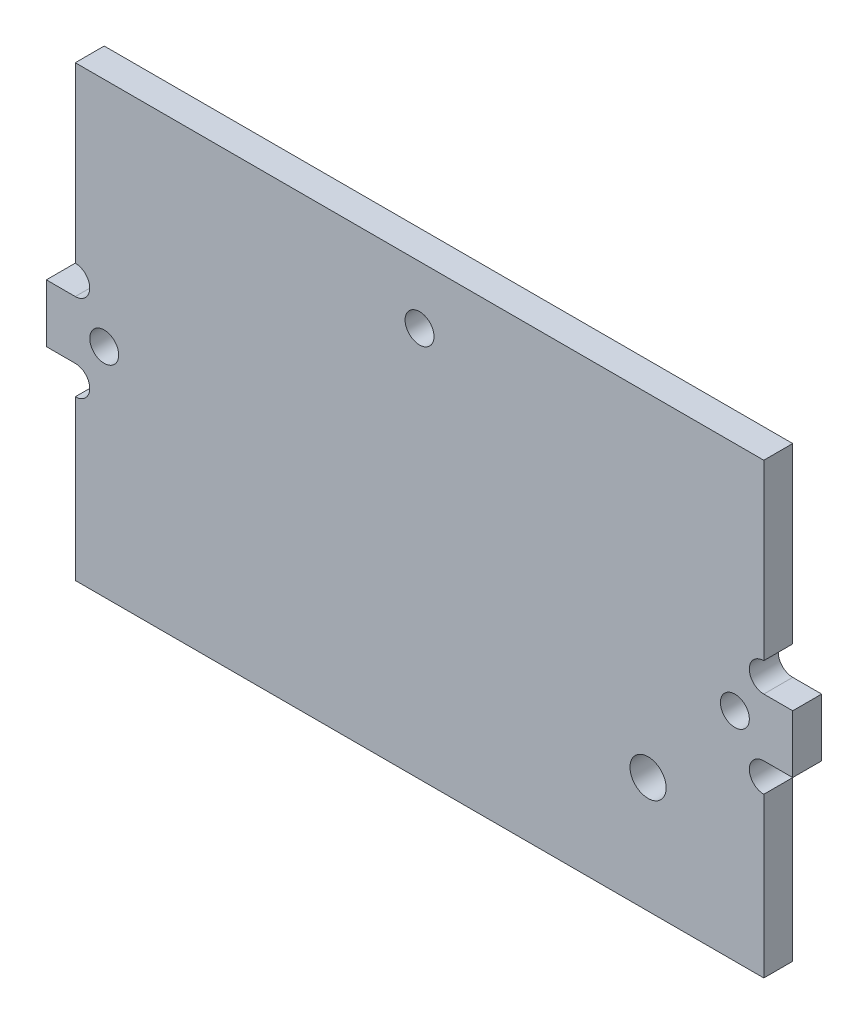
ISO-10303-21;
HEADER;
FILE_DESCRIPTION(('STEP AP214'),'2;1');
FILE_NAME('part.step','',(''),(''),'','','');
FILE_SCHEMA(('AUTOMOTIVE_DESIGN { 1 0 10303 214 1 1 1 1 }'));
ENDSEC;
DATA;
#1=APPLICATION_CONTEXT('core data for automotive mechanical design processes');
#2=APPLICATION_PROTOCOL_DEFINITION('international standard','automotive_design',2000,#1);
#3=PRODUCT_CONTEXT('',#1,'mechanical');
#4=PRODUCT('Part','Part','',(#3));
#5=PRODUCT_RELATED_PRODUCT_CATEGORY('part','',(#4));
#6=PRODUCT_DEFINITION_FORMATION('','',#4);
#7=PRODUCT_DEFINITION_CONTEXT('part definition',#1,'design');
#8=PRODUCT_DEFINITION('design','',#6,#7);
#9=PRODUCT_DEFINITION_SHAPE('','',#8);
#10=(LENGTH_UNIT() NAMED_UNIT(*) SI_UNIT(.MILLI.,.METRE.));
#11=(NAMED_UNIT(*) PLANE_ANGLE_UNIT() SI_UNIT($,.RADIAN.));
#12=(NAMED_UNIT(*) SI_UNIT($,.STERADIAN.) SOLID_ANGLE_UNIT());
#13=UNCERTAINTY_MEASURE_WITH_UNIT(LENGTH_MEASURE(1.E-05),#10,'distance_accuracy_value','');
#14=(GEOMETRIC_REPRESENTATION_CONTEXT(3) GLOBAL_UNCERTAINTY_ASSIGNED_CONTEXT((#13)) GLOBAL_UNIT_ASSIGNED_CONTEXT((#10,
#11,#12)) REPRESENTATION_CONTEXT('',''));
#15=CARTESIAN_POINT('',(0.,0.,0.));
#16=DIRECTION('',(0.,0.,1.));
#17=DIRECTION('',(1.,0.,0.));
#18=AXIS2_PLACEMENT_3D('',#15,#16,#17);
#19=CARTESIAN_POINT('',(19.0580949327945,4.88200589970501,2.));
#20=DIRECTION('',(0.,0.,-1.));
#21=DIRECTION('',(-1.,0.,0.));
#22=AXIS2_PLACEMENT_3D('',#19,#20,#21);
#23=PLANE('',#22);
#24=DIRECTION('',(-1.,0.,0.));
#25=VECTOR('',#24,1.);
#26=CARTESIAN_POINT('',(18.0580949327945,17.882005899705,2.));
#27=LINE('',#26,#25);
#28=CARTESIAN_POINT('',(19.0580949327945,17.882005899705,2.));
#29=VERTEX_POINT('',#28);
#30=CARTESIAN_POINT('',(-28.5419050672055,17.882005899705,2.));
#31=VERTEX_POINT('',#30);
#32=EDGE_CURVE('E111',#29,#31,#27,.T.);
#33=ORIENTED_EDGE('',*,*,#32,.T.);
#34=DIRECTION('',(0.,-1.,0.));
#35=VECTOR('',#34,1.);
#36=CARTESIAN_POINT('',(-28.5419050672055,17.882005899705,2.));
#37=LINE('',#36,#35);
#38=CARTESIAN_POINT('',(-28.5419050672055,5.88200589970501,2.));
#39=VERTEX_POINT('',#38);
#40=EDGE_CURVE('E299',#31,#39,#37,.T.);
#41=ORIENTED_EDGE('',*,*,#40,.T.);
#42=CARTESIAN_POINT('',(-28.5419050672055,4.88200589970501,2.));
#43=DIRECTION('',(0.,0.,-1.));
#44=DIRECTION('',(1.,0.,0.));
#45=AXIS2_PLACEMENT_3D('',#42,#43,#44);
#46=CIRCLE('',#45,1.);
#47=CARTESIAN_POINT('',(-28.5419050672055,3.88200589970501,2.));
#48=VERTEX_POINT('',#47);
#49=EDGE_CURVE('E250',#39,#48,#46,.T.);
#50=ORIENTED_EDGE('',*,*,#49,.T.);
#51=DIRECTION('',(-1.,0.,0.));
#52=VECTOR('',#51,1.);
#53=CARTESIAN_POINT('',(-28.5419050672055,3.88200589970501,2.));
#54=LINE('',#53,#52);
#55=CARTESIAN_POINT('',(-30.5419050672055,3.88200589970501,2.));
#56=VERTEX_POINT('',#55);
#57=EDGE_CURVE('E269',#48,#56,#54,.T.);
#58=ORIENTED_EDGE('',*,*,#57,.T.);
#59=DIRECTION('',(0.,-1.,0.));
#60=VECTOR('',#59,1.);
#61=CARTESIAN_POINT('',(-30.5419050672055,3.88200589970501,2.));
#62=LINE('',#61,#60);
#63=CARTESIAN_POINT('',(-30.5419050672055,-0.117994100294988,2.));
#64=VERTEX_POINT('',#63);
#65=EDGE_CURVE('E266',#56,#64,#62,.T.);
#66=ORIENTED_EDGE('',*,*,#65,.T.);
#67=DIRECTION('',(1.,0.,0.));
#68=VECTOR('',#67,1.);
#69=CARTESIAN_POINT('',(-28.5419050672055,-0.117994100294988,2.));
#70=LINE('',#69,#68);
#71=CARTESIAN_POINT('',(-28.5419050672055,-0.117994100294988,2.));
#72=VERTEX_POINT('',#71);
#73=EDGE_CURVE('E268',#64,#72,#70,.T.);
#74=ORIENTED_EDGE('',*,*,#73,.T.);
#75=CARTESIAN_POINT('',(-28.5419050672055,-1.11799410029499,2.));
#76=DIRECTION('',(0.,0.,-1.));
#77=DIRECTION('',(-1.,0.,0.));
#78=AXIS2_PLACEMENT_3D('',#75,#76,#77);
#79=CIRCLE('',#78,1.);
#80=CARTESIAN_POINT('',(-28.5419050672055,-2.11799410029499,2.));
#81=VERTEX_POINT('',#80);
#82=EDGE_CURVE('E271',#72,#81,#79,.T.);
#83=ORIENTED_EDGE('',*,*,#82,.T.);
#84=DIRECTION('',(0.,-1.,0.));
#85=VECTOR('',#84,1.);
#86=CARTESIAN_POINT('',(-28.5419050672055,-2.11799410029499,2.));
#87=LINE('',#86,#85);
#88=CARTESIAN_POINT('',(-28.5419050672055,-13.117994100295,2.));
#89=VERTEX_POINT('',#88);
#90=EDGE_CURVE('E277',#81,#89,#87,.T.);
#91=ORIENTED_EDGE('',*,*,#90,.T.);
#92=DIRECTION('',(1.,0.,0.));
#93=VECTOR('',#92,1.);
#94=CARTESIAN_POINT('',(-28.5419050672055,-13.117994100295,2.));
#95=LINE('',#94,#93);
#96=CARTESIAN_POINT('',(19.0580949327945,-13.117994100295,2.));
#97=VERTEX_POINT('',#96);
#98=EDGE_CURVE('E279',#89,#97,#95,.T.);
#99=ORIENTED_EDGE('',*,*,#98,.T.);
#100=DIRECTION('',(0.,1.,0.));
#101=VECTOR('',#100,1.);
#102=CARTESIAN_POINT('',(19.0580949327945,-12.117994100295,2.));
#103=LINE('',#102,#101);
#104=CARTESIAN_POINT('',(19.0580949327945,-2.11799410029499,2.));
#105=VERTEX_POINT('',#104);
#106=EDGE_CURVE('E281',#97,#105,#103,.T.);
#107=ORIENTED_EDGE('',*,*,#106,.T.);
#108=CARTESIAN_POINT('',(19.0580949327945,-1.11799410029499,2.));
#109=DIRECTION('',(0.,0.,-1.));
#110=DIRECTION('',(1.,0.,0.));
#111=AXIS2_PLACEMENT_3D('',#108,#109,#110);
#112=CIRCLE('',#111,1.);
#113=CARTESIAN_POINT('',(19.0580949327945,-0.117994100294988,2.));
#114=VERTEX_POINT('',#113);
#115=EDGE_CURVE('E283',#105,#114,#112,.T.);
#116=ORIENTED_EDGE('',*,*,#115,.T.);
#117=DIRECTION('',(1.,0.,0.));
#118=VECTOR('',#117,1.);
#119=CARTESIAN_POINT('',(19.0580949327945,-0.117994100294988,2.));
#120=LINE('',#119,#118);
#121=CARTESIAN_POINT('',(21.0580949327945,-0.117994100294988,2.));
#122=VERTEX_POINT('',#121);
#123=EDGE_CURVE('E285',#114,#122,#120,.T.);
#124=ORIENTED_EDGE('',*,*,#123,.T.);
#125=DIRECTION('',(0.,1.,0.));
#126=VECTOR('',#125,1.);
#127=CARTESIAN_POINT('',(21.0580949327945,3.88200589970501,2.));
#128=LINE('',#127,#126);
#129=CARTESIAN_POINT('',(21.0580949327945,3.88200589970501,2.));
#130=VERTEX_POINT('',#129);
#131=EDGE_CURVE('E156',#122,#130,#128,.T.);
#132=ORIENTED_EDGE('',*,*,#131,.T.);
#133=DIRECTION('',(-1.,0.,0.));
#134=VECTOR('',#133,1.);
#135=CARTESIAN_POINT('',(19.0580949327945,3.88200589970501,2.));
#136=LINE('',#135,#134);
#137=CARTESIAN_POINT('',(19.0580949327945,3.88200589970501,2.));
#138=VERTEX_POINT('',#137);
#139=EDGE_CURVE('E149',#130,#138,#136,.T.);
#140=ORIENTED_EDGE('',*,*,#139,.T.);
#141=CARTESIAN_POINT('',(19.0580949327945,4.88200589970501,2.));
#142=DIRECTION('',(0.,0.,-1.));
#143=DIRECTION('',(-1.,0.,0.));
#144=AXIS2_PLACEMENT_3D('',#141,#142,#143);
#145=CIRCLE('',#144,1.);
#146=CARTESIAN_POINT('',(19.0580949327945,5.88200589970501,2.));
#147=VERTEX_POINT('',#146);
#148=EDGE_CURVE('E153',#138,#147,#145,.T.);
#149=ORIENTED_EDGE('',*,*,#148,.T.);
#150=DIRECTION('',(0.,1.,0.));
#151=VECTOR('',#150,1.);
#152=CARTESIAN_POINT('',(19.0580949327945,9.88200589970501,2.));
#153=LINE('',#152,#151);
#154=EDGE_CURVE('E49',#147,#29,#153,.T.);
#155=ORIENTED_EDGE('',*,*,#154,.T.);
#156=EDGE_LOOP('',(#33,#41,#50,#58,#66,#74,#83,#91,#99,#107,#116,#124,#132,#140,#149,#155));
#157=FACE_BOUND('',#156,.T.);
#158=CARTESIAN_POINT('',(11.0580949327945,-5.11799410029498,2.));
#159=DIRECTION('',(0.,0.,1.));
#160=DIRECTION('',(1.,0.,0.));
#161=AXIS2_PLACEMENT_3D('',#158,#159,#160);
#162=CIRCLE('',#161,1.25);
#163=CARTESIAN_POINT('',(12.3080949327945,-5.11799410029498,2.));
#164=VERTEX_POINT('',#163);
#165=EDGE_CURVE('E179',#164,#164,#162,.T.);
#166=ORIENTED_EDGE('',*,*,#165,.F.);
#167=EDGE_LOOP('',(#166));
#168=FACE_BOUND('',#167,.T.);
#169=CARTESIAN_POINT('',(-26.5419050672055,1.88200589970501,2.));
#170=DIRECTION('',(0.,0.,1.));
#171=DIRECTION('',(1.,0.,0.));
#172=AXIS2_PLACEMENT_3D('',#169,#170,#171);
#173=CIRCLE('',#172,1.);
#174=CARTESIAN_POINT('',(-25.5419050672055,1.88200589970501,2.));
#175=VERTEX_POINT('',#174);
#176=EDGE_CURVE('E555',#175,#175,#173,.T.);
#177=ORIENTED_EDGE('',*,*,#176,.F.);
#178=EDGE_LOOP('',(#177));
#179=FACE_BOUND('',#178,.T.);
#180=CARTESIAN_POINT('',(17.0580949327945,1.88200589970501,2.));
#181=DIRECTION('',(0.,0.,1.));
#182=DIRECTION('',(1.,0.,0.));
#183=AXIS2_PLACEMENT_3D('',#180,#181,#182);
#184=CIRCLE('',#183,1.);
#185=CARTESIAN_POINT('',(18.0580949327945,1.88200589970501,2.));
#186=VERTEX_POINT('',#185);
#187=EDGE_CURVE('E549',#186,#186,#184,.T.);
#188=ORIENTED_EDGE('',*,*,#187,.F.);
#189=EDGE_LOOP('',(#188));
#190=FACE_BOUND('',#189,.T.);
#191=CARTESIAN_POINT('',(-4.74190506720547,13.882005899705,2.));
#192=DIRECTION('',(0.,0.,1.));
#193=DIRECTION('',(1.,0.,0.));
#194=AXIS2_PLACEMENT_3D('',#191,#192,#193);
#195=CIRCLE('',#194,1.);
#196=CARTESIAN_POINT('',(-3.74190506720547,13.882005899705,2.));
#197=VERTEX_POINT('',#196);
#198=EDGE_CURVE('E540',#197,#197,#195,.T.);
#199=ORIENTED_EDGE('',*,*,#198,.F.);
#200=EDGE_LOOP('',(#199));
#201=FACE_BOUND('',#200,.T.);
#202=ADVANCED_FACE('F32',(#157,#168,#179,#190,#201),#23,.F.);
#203=CARTESIAN_POINT('',(19.0580949327945,4.88200589970501,0.));
#204=DIRECTION('',(0.,0.,-1.));
#205=DIRECTION('',(-1.,0.,0.));
#206=AXIS2_PLACEMENT_3D('',#203,#204,#205);
#207=PLANE('',#206);
#208=CARTESIAN_POINT('',(17.0580949327945,1.88200589970501,0.));
#209=DIRECTION('',(0.,0.,1.));
#210=DIRECTION('',(1.,0.,0.));
#211=AXIS2_PLACEMENT_3D('',#208,#209,#210);
#212=CIRCLE('',#211,1.);
#213=CARTESIAN_POINT('',(18.0580949327945,1.88200589970501,0.));
#214=VERTEX_POINT('',#213);
#215=EDGE_CURVE('E546',#214,#214,#212,.T.);
#216=ORIENTED_EDGE('',*,*,#215,.T.);
#217=EDGE_LOOP('',(#216));
#218=FACE_BOUND('',#217,.T.);
#219=CARTESIAN_POINT('',(11.0580949327945,-5.11799410029498,0.));
#220=DIRECTION('',(0.,0.,1.));
#221=DIRECTION('',(1.,0.,0.));
#222=AXIS2_PLACEMENT_3D('',#219,#220,#221);
#223=CIRCLE('',#222,1.25);
#224=CARTESIAN_POINT('',(12.3080949327945,-5.11799410029498,0.));
#225=VERTEX_POINT('',#224);
#226=EDGE_CURVE('E303',#225,#225,#223,.T.);
#227=ORIENTED_EDGE('',*,*,#226,.T.);
#228=EDGE_LOOP('',(#227));
#229=FACE_BOUND('',#228,.T.);
#230=DIRECTION('',(-1.,0.,0.));
#231=VECTOR('',#230,1.);
#232=CARTESIAN_POINT('',(-27.5419050672055,17.882005899705,0.));
#233=LINE('',#232,#231);
#234=CARTESIAN_POINT('',(19.0580949327945,17.882005899705,0.));
#235=VERTEX_POINT('',#234);
#236=CARTESIAN_POINT('',(-28.5419050672055,17.882005899705,0.));
#237=VERTEX_POINT('',#236);
#238=EDGE_CURVE('E106',#235,#237,#233,.T.);
#239=ORIENTED_EDGE('',*,*,#238,.F.);
#240=DIRECTION('',(0.,1.,0.));
#241=VECTOR('',#240,1.);
#242=CARTESIAN_POINT('',(19.0580949327945,17.882005899705,0.));
#243=LINE('',#242,#241);
#244=CARTESIAN_POINT('',(19.0580949327945,5.88200589970501,0.));
#245=VERTEX_POINT('',#244);
#246=EDGE_CURVE('E102',#245,#235,#243,.T.);
#247=ORIENTED_EDGE('',*,*,#246,.F.);
#248=CARTESIAN_POINT('',(19.0580949327945,4.88200589970501,0.));
#249=DIRECTION('',(0.,0.,-1.));
#250=DIRECTION('',(-1.,0.,0.));
#251=AXIS2_PLACEMENT_3D('',#248,#249,#250);
#252=CIRCLE('',#251,1.);
#253=CARTESIAN_POINT('',(19.0580949327945,3.88200589970501,0.));
#254=VERTEX_POINT('',#253);
#255=EDGE_CURVE('E207',#254,#245,#252,.T.);
#256=ORIENTED_EDGE('',*,*,#255,.F.);
#257=DIRECTION('',(-1.,0.,0.));
#258=VECTOR('',#257,1.);
#259=CARTESIAN_POINT('',(19.0580949327945,3.88200589970501,0.));
#260=LINE('',#259,#258);
#261=CARTESIAN_POINT('',(21.0580949327945,3.88200589970501,0.));
#262=VERTEX_POINT('',#261);
#263=EDGE_CURVE('E165',#262,#254,#260,.T.);
#264=ORIENTED_EDGE('',*,*,#263,.F.);
#265=DIRECTION('',(0.,1.,0.));
#266=VECTOR('',#265,1.);
#267=CARTESIAN_POINT('',(21.0580949327945,3.88200589970501,0.));
#268=LINE('',#267,#266);
#269=CARTESIAN_POINT('',(21.0580949327945,-0.117994100294988,0.));
#270=VERTEX_POINT('',#269);
#271=EDGE_CURVE('E204',#270,#262,#268,.T.);
#272=ORIENTED_EDGE('',*,*,#271,.F.);
#273=DIRECTION('',(1.,0.,0.));
#274=VECTOR('',#273,1.);
#275=CARTESIAN_POINT('',(19.0580949327945,-0.117994100294988,0.));
#276=LINE('',#275,#274);
#277=CARTESIAN_POINT('',(19.0580949327945,-0.117994100294988,0.));
#278=VERTEX_POINT('',#277);
#279=EDGE_CURVE('E202',#278,#270,#276,.T.);
#280=ORIENTED_EDGE('',*,*,#279,.F.);
#281=CARTESIAN_POINT('',(19.0580949327945,-1.11799410029499,0.));
#282=DIRECTION('',(0.,0.,-1.));
#283=DIRECTION('',(1.,0.,0.));
#284=AXIS2_PLACEMENT_3D('',#281,#282,#283);
#285=CIRCLE('',#284,1.);
#286=CARTESIAN_POINT('',(19.0580949327945,-2.11799410029499,0.));
#287=VERTEX_POINT('',#286);
#288=EDGE_CURVE('E200',#287,#278,#285,.T.);
#289=ORIENTED_EDGE('',*,*,#288,.F.);
#290=DIRECTION('',(0.,1.,0.));
#291=VECTOR('',#290,1.);
#292=CARTESIAN_POINT('',(19.0580949327945,-2.11799410029499,0.));
#293=LINE('',#292,#291);
#294=CARTESIAN_POINT('',(19.0580949327945,-13.117994100295,0.));
#295=VERTEX_POINT('',#294);
#296=EDGE_CURVE('E198',#295,#287,#293,.T.);
#297=ORIENTED_EDGE('',*,*,#296,.F.);
#298=DIRECTION('',(1.,0.,0.));
#299=VECTOR('',#298,1.);
#300=CARTESIAN_POINT('',(19.0580949327945,-13.117994100295,0.));
#301=LINE('',#300,#299);
#302=CARTESIAN_POINT('',(-28.5419050672055,-13.117994100295,0.));
#303=VERTEX_POINT('',#302);
#304=EDGE_CURVE('E195',#303,#295,#301,.T.);
#305=ORIENTED_EDGE('',*,*,#304,.F.);
#306=DIRECTION('',(0.,-1.,0.));
#307=VECTOR('',#306,1.);
#308=CARTESIAN_POINT('',(-28.5419050672055,-12.117994100295,0.));
#309=LINE('',#308,#307);
#310=CARTESIAN_POINT('',(-28.5419050672055,-2.11799410029499,0.));
#311=VERTEX_POINT('',#310);
#312=EDGE_CURVE('E192',#311,#303,#309,.T.);
#313=ORIENTED_EDGE('',*,*,#312,.F.);
#314=CARTESIAN_POINT('',(-28.5419050672055,-1.11799410029499,0.));
#315=DIRECTION('',(0.,0.,-1.));
#316=DIRECTION('',(-1.,0.,0.));
#317=AXIS2_PLACEMENT_3D('',#314,#315,#316);
#318=CIRCLE('',#317,1.);
#319=CARTESIAN_POINT('',(-28.5419050672055,-0.117994100294988,0.));
#320=VERTEX_POINT('',#319);
#321=EDGE_CURVE('E189',#320,#311,#318,.T.);
#322=ORIENTED_EDGE('',*,*,#321,.F.);
#323=DIRECTION('',(1.,0.,0.));
#324=VECTOR('',#323,1.);
#325=CARTESIAN_POINT('',(-28.5419050672055,-0.117994100294988,0.));
#326=LINE('',#325,#324);
#327=CARTESIAN_POINT('',(-30.5419050672055,-0.117994100294988,0.));
#328=VERTEX_POINT('',#327);
#329=EDGE_CURVE('E187',#328,#320,#326,.T.);
#330=ORIENTED_EDGE('',*,*,#329,.F.);
#331=DIRECTION('',(0.,-1.,0.));
#332=VECTOR('',#331,1.);
#333=CARTESIAN_POINT('',(-30.5419050672055,3.88200589970501,0.));
#334=LINE('',#333,#332);
#335=CARTESIAN_POINT('',(-30.5419050672055,3.88200589970501,0.));
#336=VERTEX_POINT('',#335);
#337=EDGE_CURVE('E185',#336,#328,#334,.T.);
#338=ORIENTED_EDGE('',*,*,#337,.F.);
#339=DIRECTION('',(-1.,0.,0.));
#340=VECTOR('',#339,1.);
#341=CARTESIAN_POINT('',(-28.5419050672055,3.88200589970501,0.));
#342=LINE('',#341,#340);
#343=CARTESIAN_POINT('',(-28.5419050672055,3.88200589970501,0.));
#344=VERTEX_POINT('',#343);
#345=EDGE_CURVE('E183',#344,#336,#342,.T.);
#346=ORIENTED_EDGE('',*,*,#345,.F.);
#347=CARTESIAN_POINT('',(-28.5419050672055,4.88200589970501,0.));
#348=DIRECTION('',(0.,0.,-1.));
#349=DIRECTION('',(1.,0.,0.));
#350=AXIS2_PLACEMENT_3D('',#347,#348,#349);
#351=CIRCLE('',#350,1.);
#352=CARTESIAN_POINT('',(-28.5419050672055,5.88200589970501,0.));
#353=VERTEX_POINT('',#352);
#354=EDGE_CURVE('E181',#353,#344,#351,.T.);
#355=ORIENTED_EDGE('',*,*,#354,.F.);
#356=DIRECTION('',(0.,-1.,0.));
#357=VECTOR('',#356,1.);
#358=CARTESIAN_POINT('',(-28.5419050672055,9.88200589970501,0.));
#359=LINE('',#358,#357);
#360=EDGE_CURVE('E178',#237,#353,#359,.T.);
#361=ORIENTED_EDGE('',*,*,#360,.F.);
#362=EDGE_LOOP('',(#239,#247,#256,#264,#272,#280,#289,#297,#305,#313,#322,#330,#338,#346,#355,#361));
#363=FACE_BOUND('',#362,.T.);
#364=CARTESIAN_POINT('',(-26.5419050672055,1.88200589970501,0.));
#365=DIRECTION('',(0.,0.,1.));
#366=DIRECTION('',(1.,0.,0.));
#367=AXIS2_PLACEMENT_3D('',#364,#365,#366);
#368=CIRCLE('',#367,1.);
#369=CARTESIAN_POINT('',(-25.5419050672055,1.88200589970501,0.));
#370=VERTEX_POINT('',#369);
#371=EDGE_CURVE('E552',#370,#370,#368,.T.);
#372=ORIENTED_EDGE('',*,*,#371,.T.);
#373=EDGE_LOOP('',(#372));
#374=FACE_BOUND('',#373,.T.);
#375=CARTESIAN_POINT('',(-4.74190506720547,13.882005899705,0.));
#376=DIRECTION('',(0.,0.,1.));
#377=DIRECTION('',(1.,0.,0.));
#378=AXIS2_PLACEMENT_3D('',#375,#376,#377);
#379=CIRCLE('',#378,1.);
#380=CARTESIAN_POINT('',(-3.74190506720547,13.882005899705,0.));
#381=VERTEX_POINT('',#380);
#382=EDGE_CURVE('E543',#381,#381,#379,.T.);
#383=ORIENTED_EDGE('',*,*,#382,.T.);
#384=EDGE_LOOP('',(#383));
#385=FACE_BOUND('',#384,.T.);
#386=ADVANCED_FACE('F254',(#218,#229,#363,#374,#385),#207,.T.);
#387=CARTESIAN_POINT('',(-27.5419050672055,17.882005899705,2.));
#388=DIRECTION('',(0.,-1.,0.));
#389=DIRECTION('',(0.,0.,-1.));
#390=AXIS2_PLACEMENT_3D('',#387,#388,#389);
#391=PLANE('',#390);
#392=ORIENTED_EDGE('',*,*,#238,.T.);
#393=DIRECTION('',(0.,0.,-1.));
#394=VECTOR('',#393,1.);
#395=CARTESIAN_POINT('',(-28.5419050672055,17.882005899705,2.));
#396=LINE('',#395,#394);
#397=EDGE_CURVE('E11',#31,#237,#396,.T.);
#398=ORIENTED_EDGE('',*,*,#397,.F.);
#399=ORIENTED_EDGE('',*,*,#32,.F.);
#400=DIRECTION('',(0.,0.,-1.));
#401=VECTOR('',#400,1.);
#402=CARTESIAN_POINT('',(19.0580949327945,17.882005899705,2.));
#403=LINE('',#402,#401);
#404=EDGE_CURVE('E173',#29,#235,#403,.T.);
#405=ORIENTED_EDGE('',*,*,#404,.T.);
#406=EDGE_LOOP('',(#392,#398,#399,#405));
#407=FACE_BOUND('',#406,.T.);
#408=ADVANCED_FACE('F34',(#407),#391,.F.);
#409=CARTESIAN_POINT('',(-28.5419050672055,9.88200589970501,2.));
#410=DIRECTION('',(1.,0.,0.));
#411=DIRECTION('',(0.,1.,0.));
#412=AXIS2_PLACEMENT_3D('',#409,#410,#411);
#413=PLANE('',#412);
#414=ORIENTED_EDGE('',*,*,#360,.T.);
#415=DIRECTION('',(0.,0.,-1.));
#416=VECTOR('',#415,1.);
#417=CARTESIAN_POINT('',(-28.5419050672055,5.88200589970501,2.));
#418=LINE('',#417,#416);
#419=EDGE_CURVE('E41',#39,#353,#418,.T.);
#420=ORIENTED_EDGE('',*,*,#419,.F.);
#421=ORIENTED_EDGE('',*,*,#40,.F.);
#422=ORIENTED_EDGE('',*,*,#397,.T.);
#423=EDGE_LOOP('',(#414,#420,#421,#422));
#424=FACE_BOUND('',#423,.T.);
#425=ADVANCED_FACE('F305',(#424),#413,.F.);
#426=CARTESIAN_POINT('',(-28.5419050672055,4.88200589970501,2.));
#427=DIRECTION('',(0.,0.,-1.));
#428=DIRECTION('',(-1.,0.,0.));
#429=AXIS2_PLACEMENT_3D('',#426,#427,#428);
#430=CYLINDRICAL_SURFACE('',#429,1.);
#431=ORIENTED_EDGE('',*,*,#354,.T.);
#432=DIRECTION('',(0.,0.,-1.));
#433=VECTOR('',#432,1.);
#434=CARTESIAN_POINT('',(-28.5419050672055,3.88200589970501,2.));
#435=LINE('',#434,#433);
#436=EDGE_CURVE('E241',#48,#344,#435,.T.);
#437=ORIENTED_EDGE('',*,*,#436,.F.);
#438=ORIENTED_EDGE('',*,*,#49,.F.);
#439=ORIENTED_EDGE('',*,*,#419,.T.);
#440=EDGE_LOOP('',(#431,#437,#438,#439));
#441=FACE_BOUND('',#440,.T.);
#442=ADVANCED_FACE('F248',(#441),#430,.F.);
#443=CARTESIAN_POINT('',(-28.5419050672055,3.88200589970501,2.));
#444=DIRECTION('',(0.,-1.,0.));
#445=DIRECTION('',(1.,0.,0.));
#446=AXIS2_PLACEMENT_3D('',#443,#444,#445);
#447=PLANE('',#446);
#448=ORIENTED_EDGE('',*,*,#345,.T.);
#449=DIRECTION('',(0.,0.,-1.));
#450=VECTOR('',#449,1.);
#451=CARTESIAN_POINT('',(-30.5419050672055,3.88200589970501,2.));
#452=LINE('',#451,#450);
#453=EDGE_CURVE('E238',#56,#336,#452,.T.);
#454=ORIENTED_EDGE('',*,*,#453,.F.);
#455=ORIENTED_EDGE('',*,*,#57,.F.);
#456=ORIENTED_EDGE('',*,*,#436,.T.);
#457=EDGE_LOOP('',(#448,#454,#455,#456));
#458=FACE_BOUND('',#457,.T.);
#459=ADVANCED_FACE('F260',(#458),#447,.F.);
#460=CARTESIAN_POINT('',(-30.5419050672055,3.88200589970501,2.));
#461=DIRECTION('',(1.,0.,0.));
#462=DIRECTION('',(0.,0.,-1.));
#463=AXIS2_PLACEMENT_3D('',#460,#461,#462);
#464=PLANE('',#463);
#465=ORIENTED_EDGE('',*,*,#337,.T.);
#466=DIRECTION('',(0.,0.,-1.));
#467=VECTOR('',#466,1.);
#468=CARTESIAN_POINT('',(-30.5419050672055,-0.117994100294988,2.));
#469=LINE('',#468,#467);
#470=EDGE_CURVE('E235',#64,#328,#469,.T.);
#471=ORIENTED_EDGE('',*,*,#470,.F.);
#472=ORIENTED_EDGE('',*,*,#65,.F.);
#473=ORIENTED_EDGE('',*,*,#453,.T.);
#474=EDGE_LOOP('',(#465,#471,#472,#473));
#475=FACE_BOUND('',#474,.T.);
#476=ADVANCED_FACE('F264',(#475),#464,.F.);
#477=CARTESIAN_POINT('',(-28.5419050672055,-0.117994100294988,2.));
#478=DIRECTION('',(0.,1.,0.));
#479=DIRECTION('',(-1.,0.,0.));
#480=AXIS2_PLACEMENT_3D('',#477,#478,#479);
#481=PLANE('',#480);
#482=ORIENTED_EDGE('',*,*,#329,.T.);
#483=DIRECTION('',(0.,0.,-1.));
#484=VECTOR('',#483,1.);
#485=CARTESIAN_POINT('',(-28.5419050672055,-0.117994100294988,2.));
#486=LINE('',#485,#484);
#487=EDGE_CURVE('E232',#72,#320,#486,.T.);
#488=ORIENTED_EDGE('',*,*,#487,.F.);
#489=ORIENTED_EDGE('',*,*,#73,.F.);
#490=ORIENTED_EDGE('',*,*,#470,.T.);
#491=EDGE_LOOP('',(#482,#488,#489,#490));
#492=FACE_BOUND('',#491,.T.);
#493=ADVANCED_FACE('F352',(#492),#481,.F.);
#494=CARTESIAN_POINT('',(-28.5419050672055,-1.11799410029499,2.));
#495=DIRECTION('',(0.,0.,-1.));
#496=DIRECTION('',(-1.,0.,0.));
#497=AXIS2_PLACEMENT_3D('',#494,#495,#496);
#498=CYLINDRICAL_SURFACE('',#497,1.);
#499=ORIENTED_EDGE('',*,*,#321,.T.);
#500=DIRECTION('',(0.,0.,-1.));
#501=VECTOR('',#500,1.);
#502=CARTESIAN_POINT('',(-28.5419050672055,-2.11799410029499,2.));
#503=LINE('',#502,#501);
#504=EDGE_CURVE('E229',#81,#311,#503,.T.);
#505=ORIENTED_EDGE('',*,*,#504,.F.);
#506=ORIENTED_EDGE('',*,*,#82,.F.);
#507=ORIENTED_EDGE('',*,*,#487,.T.);
#508=EDGE_LOOP('',(#499,#505,#506,#507));
#509=FACE_BOUND('',#508,.T.);
#510=ADVANCED_FACE('F348',(#509),#498,.F.);
#511=CARTESIAN_POINT('',(-28.5419050672055,-12.117994100295,2.));
#512=DIRECTION('',(1.,0.,0.));
#513=DIRECTION('',(0.,0.,-1.));
#514=AXIS2_PLACEMENT_3D('',#511,#512,#513);
#515=PLANE('',#514);
#516=ORIENTED_EDGE('',*,*,#312,.T.);
#517=DIRECTION('',(0.,0.,-1.));
#518=VECTOR('',#517,1.);
#519=CARTESIAN_POINT('',(-28.5419050672055,-13.117994100295,2.));
#520=LINE('',#519,#518);
#521=EDGE_CURVE('E226',#89,#303,#520,.T.);
#522=ORIENTED_EDGE('',*,*,#521,.F.);
#523=ORIENTED_EDGE('',*,*,#90,.F.);
#524=ORIENTED_EDGE('',*,*,#504,.T.);
#525=EDGE_LOOP('',(#516,#522,#523,#524));
#526=FACE_BOUND('',#525,.T.);
#527=ADVANCED_FACE('F344',(#526),#515,.F.);
#528=CARTESIAN_POINT('',(19.0580949327945,-13.117994100295,2.));
#529=DIRECTION('',(0.,1.,0.));
#530=DIRECTION('',(0.,0.,1.));
#531=AXIS2_PLACEMENT_3D('',#528,#529,#530);
#532=PLANE('',#531);
#533=ORIENTED_EDGE('',*,*,#304,.T.);
#534=DIRECTION('',(0.,0.,-1.));
#535=VECTOR('',#534,1.);
#536=CARTESIAN_POINT('',(19.0580949327945,-13.117994100295,2.));
#537=LINE('',#536,#535);
#538=EDGE_CURVE('E223',#97,#295,#537,.T.);
#539=ORIENTED_EDGE('',*,*,#538,.F.);
#540=ORIENTED_EDGE('',*,*,#98,.F.);
#541=ORIENTED_EDGE('',*,*,#521,.T.);
#542=EDGE_LOOP('',(#533,#539,#540,#541));
#543=FACE_BOUND('',#542,.T.);
#544=ADVANCED_FACE('F340',(#543),#532,.F.);
#545=CARTESIAN_POINT('',(19.0580949327945,-2.11799410029499,2.));
#546=DIRECTION('',(-1.,0.,0.));
#547=DIRECTION('',(0.,-1.,0.));
#548=AXIS2_PLACEMENT_3D('',#545,#546,#547);
#549=PLANE('',#548);
#550=ORIENTED_EDGE('',*,*,#296,.T.);
#551=DIRECTION('',(0.,0.,-1.));
#552=VECTOR('',#551,1.);
#553=CARTESIAN_POINT('',(19.0580949327945,-2.11799410029499,2.));
#554=LINE('',#553,#552);
#555=EDGE_CURVE('E220',#105,#287,#554,.T.);
#556=ORIENTED_EDGE('',*,*,#555,.F.);
#557=ORIENTED_EDGE('',*,*,#106,.F.);
#558=ORIENTED_EDGE('',*,*,#538,.T.);
#559=EDGE_LOOP('',(#550,#556,#557,#558));
#560=FACE_BOUND('',#559,.T.);
#561=ADVANCED_FACE('F336',(#560),#549,.F.);
#562=CARTESIAN_POINT('',(19.0580949327945,-1.11799410029499,2.));
#563=DIRECTION('',(0.,0.,-1.));
#564=DIRECTION('',(-1.,0.,0.));
#565=AXIS2_PLACEMENT_3D('',#562,#563,#564);
#566=CYLINDRICAL_SURFACE('',#565,1.);
#567=ORIENTED_EDGE('',*,*,#288,.T.);
#568=DIRECTION('',(0.,0.,-1.));
#569=VECTOR('',#568,1.);
#570=CARTESIAN_POINT('',(19.0580949327945,-0.117994100294988,2.));
#571=LINE('',#570,#569);
#572=EDGE_CURVE('E217',#114,#278,#571,.T.);
#573=ORIENTED_EDGE('',*,*,#572,.F.);
#574=ORIENTED_EDGE('',*,*,#115,.F.);
#575=ORIENTED_EDGE('',*,*,#555,.T.);
#576=EDGE_LOOP('',(#567,#573,#574,#575));
#577=FACE_BOUND('',#576,.T.);
#578=ADVANCED_FACE('F333',(#577),#566,.F.);
#579=CARTESIAN_POINT('',(19.0580949327945,-0.117994100294988,2.));
#580=DIRECTION('',(0.,1.,0.));
#581=DIRECTION('',(-1.,0.,0.));
#582=AXIS2_PLACEMENT_3D('',#579,#580,#581);
#583=PLANE('',#582);
#584=ORIENTED_EDGE('',*,*,#279,.T.);
#585=DIRECTION('',(0.,0.,-1.));
#586=VECTOR('',#585,1.);
#587=CARTESIAN_POINT('',(21.0580949327945,-0.117994100294988,2.));
#588=LINE('',#587,#586);
#589=EDGE_CURVE('E214',#122,#270,#588,.T.);
#590=ORIENTED_EDGE('',*,*,#589,.F.);
#591=ORIENTED_EDGE('',*,*,#123,.F.);
#592=ORIENTED_EDGE('',*,*,#572,.T.);
#593=EDGE_LOOP('',(#584,#590,#591,#592));
#594=FACE_BOUND('',#593,.T.);
#595=ADVANCED_FACE('F291',(#594),#583,.F.);
#596=CARTESIAN_POINT('',(21.0580949327945,3.88200589970501,2.));
#597=DIRECTION('',(-1.,0.,0.));
#598=DIRECTION('',(0.,0.,1.));
#599=AXIS2_PLACEMENT_3D('',#596,#597,#598);
#600=PLANE('',#599);
#601=ORIENTED_EDGE('',*,*,#271,.T.);
#602=DIRECTION('',(0.,0.,-1.));
#603=VECTOR('',#602,1.);
#604=CARTESIAN_POINT('',(21.0580949327945,3.88200589970501,2.));
#605=LINE('',#604,#603);
#606=EDGE_CURVE('E167',#130,#262,#605,.T.);
#607=ORIENTED_EDGE('',*,*,#606,.F.);
#608=ORIENTED_EDGE('',*,*,#131,.F.);
#609=ORIENTED_EDGE('',*,*,#589,.T.);
#610=EDGE_LOOP('',(#601,#607,#608,#609));
#611=FACE_BOUND('',#610,.T.);
#612=ADVANCED_FACE('F295',(#611),#600,.F.);
#613=CARTESIAN_POINT('',(19.0580949327945,3.88200589970501,2.));
#614=DIRECTION('',(0.,-1.,0.));
#615=DIRECTION('',(1.,0.,0.));
#616=AXIS2_PLACEMENT_3D('',#613,#614,#615);
#617=PLANE('',#616);
#618=ORIENTED_EDGE('',*,*,#263,.T.);
#619=DIRECTION('',(0.,0.,-1.));
#620=VECTOR('',#619,1.);
#621=CARTESIAN_POINT('',(19.0580949327945,3.88200589970501,2.));
#622=LINE('',#621,#620);
#623=EDGE_CURVE('E162',#138,#254,#622,.T.);
#624=ORIENTED_EDGE('',*,*,#623,.F.);
#625=ORIENTED_EDGE('',*,*,#139,.F.);
#626=ORIENTED_EDGE('',*,*,#606,.T.);
#627=EDGE_LOOP('',(#618,#624,#625,#626));
#628=FACE_BOUND('',#627,.T.);
#629=ADVANCED_FACE('F163',(#628),#617,.F.);
#630=CARTESIAN_POINT('',(19.0580949327945,4.88200589970501,2.));
#631=DIRECTION('',(0.,0.,-1.));
#632=DIRECTION('',(-1.,0.,0.));
#633=AXIS2_PLACEMENT_3D('',#630,#631,#632);
#634=CYLINDRICAL_SURFACE('',#633,1.);
#635=ORIENTED_EDGE('',*,*,#255,.T.);
#636=DIRECTION('',(0.,0.,-1.));
#637=VECTOR('',#636,1.);
#638=CARTESIAN_POINT('',(19.0580949327945,5.88200589970501,2.));
#639=LINE('',#638,#637);
#640=EDGE_CURVE('E168',#147,#245,#639,.T.);
#641=ORIENTED_EDGE('',*,*,#640,.F.);
#642=ORIENTED_EDGE('',*,*,#148,.F.);
#643=ORIENTED_EDGE('',*,*,#623,.T.);
#644=EDGE_LOOP('',(#635,#641,#642,#643));
#645=FACE_BOUND('',#644,.T.);
#646=ADVANCED_FACE('F170',(#645),#634,.F.);
#647=CARTESIAN_POINT('',(19.0580949327945,17.882005899705,2.));
#648=DIRECTION('',(-1.,0.,0.));
#649=DIRECTION('',(0.,0.,1.));
#650=AXIS2_PLACEMENT_3D('',#647,#648,#649);
#651=PLANE('',#650);
#652=ORIENTED_EDGE('',*,*,#246,.T.);
#653=ORIENTED_EDGE('',*,*,#404,.F.);
#654=ORIENTED_EDGE('',*,*,#154,.F.);
#655=ORIENTED_EDGE('',*,*,#640,.T.);
#656=EDGE_LOOP('',(#652,#653,#654,#655));
#657=FACE_BOUND('',#656,.T.);
#658=ADVANCED_FACE('F297',(#657),#651,.F.);
#659=CARTESIAN_POINT('',(11.0580949327945,-5.11799410029498,2.));
#660=DIRECTION('',(0.,0.,-1.));
#661=DIRECTION('',(-1.,0.,0.));
#662=AXIS2_PLACEMENT_3D('',#659,#660,#661);
#663=CYLINDRICAL_SURFACE('',#662,1.25);
#664=ORIENTED_EDGE('',*,*,#165,.T.);
#665=EDGE_LOOP('',(#664));
#666=FACE_BOUND('',#665,.T.);
#667=ORIENTED_EDGE('',*,*,#226,.F.);
#668=EDGE_LOOP('',(#667));
#669=FACE_BOUND('',#668,.T.);
#670=ADVANCED_FACE('F320',(#666,#669),#663,.F.);
#671=CARTESIAN_POINT('',(-26.5419050672055,1.88200589970501,2.));
#672=DIRECTION('',(0.,0.,-1.));
#673=DIRECTION('',(-1.,0.,0.));
#674=AXIS2_PLACEMENT_3D('',#671,#672,#673);
#675=CYLINDRICAL_SURFACE('',#674,1.);
#676=ORIENTED_EDGE('',*,*,#176,.T.);
#677=EDGE_LOOP('',(#676));
#678=FACE_BOUND('',#677,.T.);
#679=ORIENTED_EDGE('',*,*,#371,.F.);
#680=EDGE_LOOP('',(#679));
#681=FACE_BOUND('',#680,.T.);
#682=ADVANCED_FACE('F418',(#678,#681),#675,.F.);
#683=CARTESIAN_POINT('',(17.0580949327945,1.88200589970501,2.));
#684=DIRECTION('',(0.,0.,-1.));
#685=DIRECTION('',(-1.,0.,0.));
#686=AXIS2_PLACEMENT_3D('',#683,#684,#685);
#687=CYLINDRICAL_SURFACE('',#686,1.);
#688=ORIENTED_EDGE('',*,*,#187,.T.);
#689=EDGE_LOOP('',(#688));
#690=FACE_BOUND('',#689,.T.);
#691=ORIENTED_EDGE('',*,*,#215,.F.);
#692=EDGE_LOOP('',(#691));
#693=FACE_BOUND('',#692,.T.);
#694=ADVANCED_FACE('F425',(#690,#693),#687,.F.);
#695=CARTESIAN_POINT('',(-4.74190506720547,13.882005899705,2.));
#696=DIRECTION('',(0.,0.,-1.));
#697=DIRECTION('',(-1.,0.,0.));
#698=AXIS2_PLACEMENT_3D('',#695,#696,#697);
#699=CYLINDRICAL_SURFACE('',#698,1.);
#700=ORIENTED_EDGE('',*,*,#198,.T.);
#701=EDGE_LOOP('',(#700));
#702=FACE_BOUND('',#701,.T.);
#703=ORIENTED_EDGE('',*,*,#382,.F.);
#704=EDGE_LOOP('',(#703));
#705=FACE_BOUND('',#704,.T.);
#706=ADVANCED_FACE('F432',(#702,#705),#699,.F.);
#707=CLOSED_SHELL('',(#202,#386,#408,#425,#442,#459,#476,#493,#510,#527,#544,#561,#578,#595,
#612,#629,#646,#658,#670,#682,#694,#706));
#708=MANIFOLD_SOLID_BREP('B2',#707);
#709=ADVANCED_BREP_SHAPE_REPRESENTATION('',(#18,#708),#14);
#710=SHAPE_DEFINITION_REPRESENTATION(#9,#709);
ENDSEC;
END-ISO-10303-21;
